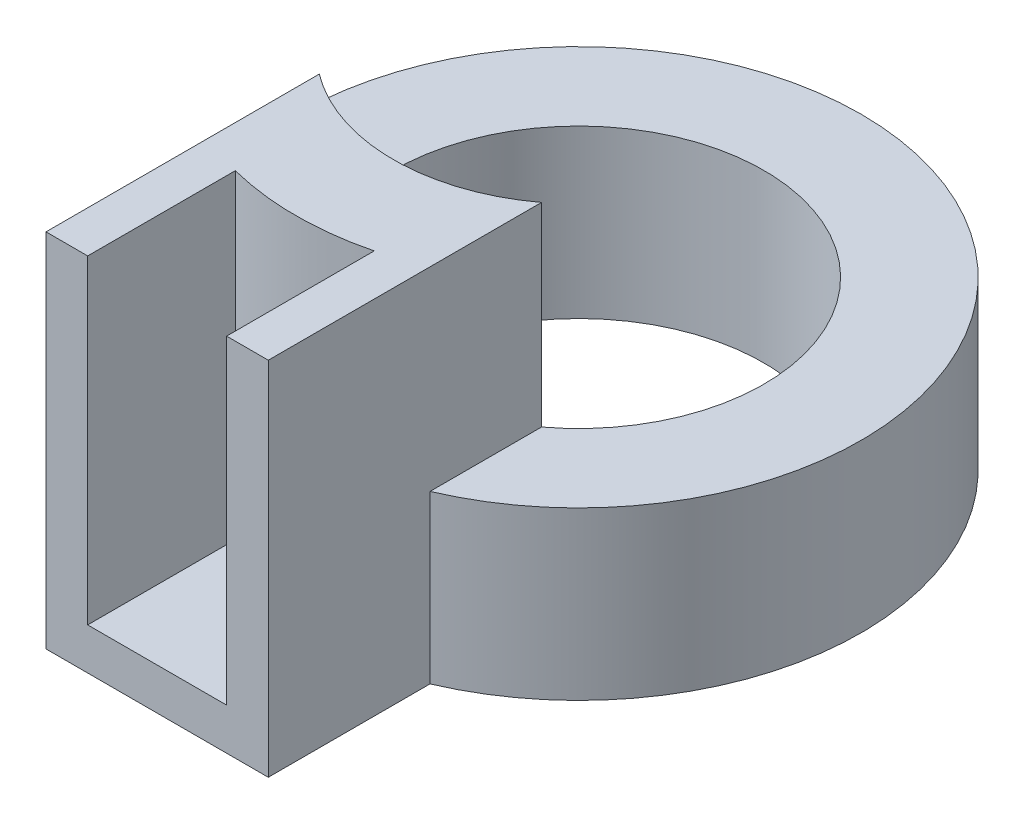
ISO-10303-21;
HEADER;
FILE_DESCRIPTION(('STEP AP214'),'2;1');
FILE_NAME('part.step','',(''),(''),'','','');
FILE_SCHEMA(('AUTOMOTIVE_DESIGN { 1 0 10303 214 1 1 1 1 }'));
ENDSEC;
DATA;
#1=APPLICATION_CONTEXT('core data for automotive mechanical design processes');
#2=APPLICATION_PROTOCOL_DEFINITION('international standard','automotive_design',2000,#1);
#3=PRODUCT_CONTEXT('',#1,'mechanical');
#4=PRODUCT('Part','Part','',(#3));
#5=PRODUCT_RELATED_PRODUCT_CATEGORY('part','',(#4));
#6=PRODUCT_DEFINITION_FORMATION('','',#4);
#7=PRODUCT_DEFINITION_CONTEXT('part definition',#1,'design');
#8=PRODUCT_DEFINITION('design','',#6,#7);
#9=PRODUCT_DEFINITION_SHAPE('','',#8);
#10=(LENGTH_UNIT() NAMED_UNIT(*) SI_UNIT(.MILLI.,.METRE.));
#11=(NAMED_UNIT(*) PLANE_ANGLE_UNIT() SI_UNIT($,.RADIAN.));
#12=(NAMED_UNIT(*) SI_UNIT($,.STERADIAN.) SOLID_ANGLE_UNIT());
#13=UNCERTAINTY_MEASURE_WITH_UNIT(LENGTH_MEASURE(1.E-05),#10,'distance_accuracy_value','');
#14=(GEOMETRIC_REPRESENTATION_CONTEXT(3) GLOBAL_UNCERTAINTY_ASSIGNED_CONTEXT((#13)) GLOBAL_UNIT_ASSIGNED_CONTEXT((#10,
#11,#12)) REPRESENTATION_CONTEXT('',''));
#15=CARTESIAN_POINT('',(0.,0.,0.));
#16=DIRECTION('',(0.,0.,1.));
#17=DIRECTION('',(1.,0.,0.));
#18=AXIS2_PLACEMENT_3D('',#15,#16,#17);
#19=CARTESIAN_POINT('',(-5.,23.,-20.336));
#20=DIRECTION('',(-1.,0.,0.));
#21=DIRECTION('',(0.,-1.,0.));
#22=AXIS2_PLACEMENT_3D('',#19,#20,#21);
#23=PLANE('',#22);
#24=DIRECTION('',(0.,-1.,0.));
#25=VECTOR('',#24,1.);
#26=CARTESIAN_POINT('',(-5.,12.,19.7107134574069));
#27=LINE('',#26,#25);
#28=CARTESIAN_POINT('',(-5.,3.,19.7107134574069));
#29=VERTEX_POINT('',#28);
#30=CARTESIAN_POINT('',(-4.99999999999999,26.,19.7107134574069));
#31=VERTEX_POINT('',#30);
#32=EDGE_CURVE('E123',#29,#31,#27,.F.);
#33=ORIENTED_EDGE('',*,*,#32,.T.);
#34=DIRECTION('',(0.,0.,1.));
#35=VECTOR('',#34,1.);
#36=CARTESIAN_POINT('',(-5.,26.,-20.336));
#37=LINE('',#36,#35);
#38=CARTESIAN_POINT('',(-5.,26.,30.335));
#39=VERTEX_POINT('',#38);
#40=EDGE_CURVE('E133',#31,#39,#37,.T.);
#41=ORIENTED_EDGE('',*,*,#40,.T.);
#42=DIRECTION('',(0.,-1.,0.));
#43=VECTOR('',#42,1.);
#44=CARTESIAN_POINT('',(-5.,23.,30.335));
#45=LINE('',#44,#43);
#46=CARTESIAN_POINT('',(-5.,3.,30.335));
#47=VERTEX_POINT('',#46);
#48=EDGE_CURVE('E54',#39,#47,#45,.T.);
#49=ORIENTED_EDGE('',*,*,#48,.T.);
#50=DIRECTION('',(0.,0.,1.));
#51=VECTOR('',#50,1.);
#52=CARTESIAN_POINT('',(-5.,3.,-20.336));
#53=LINE('',#52,#51);
#54=EDGE_CURVE('E176',#29,#47,#53,.T.);
#55=ORIENTED_EDGE('',*,*,#54,.F.);
#56=EDGE_LOOP('',(#33,#41,#49,#55));
#57=FACE_BOUND('',#56,.T.);
#58=ADVANCED_FACE('F39',(#57),#23,.F.);
#59=CARTESIAN_POINT('',(5.,23.,-20.336));
#60=DIRECTION('',(1.,0.,0.));
#61=DIRECTION('',(0.,1.,0.));
#62=AXIS2_PLACEMENT_3D('',#59,#60,#61);
#63=PLANE('',#62);
#64=DIRECTION('',(0.,0.,1.));
#65=VECTOR('',#64,1.);
#66=CARTESIAN_POINT('',(5.,26.,-20.336));
#67=LINE('',#66,#65);
#68=CARTESIAN_POINT('',(5.,26.,19.7107134574069));
#69=VERTEX_POINT('',#68);
#70=CARTESIAN_POINT('',(5.,26.,30.335));
#71=VERTEX_POINT('',#70);
#72=EDGE_CURVE('E126',#69,#71,#67,.T.);
#73=ORIENTED_EDGE('',*,*,#72,.F.);
#74=DIRECTION('',(0.,-1.,0.));
#75=VECTOR('',#74,1.);
#76=CARTESIAN_POINT('',(5.,12.,19.7107134574069));
#77=LINE('',#76,#75);
#78=CARTESIAN_POINT('',(5.,3.,19.7107134574069));
#79=VERTEX_POINT('',#78);
#80=EDGE_CURVE('E115',#69,#79,#77,.T.);
#81=ORIENTED_EDGE('',*,*,#80,.T.);
#82=DIRECTION('',(0.,0.,1.));
#83=VECTOR('',#82,1.);
#84=CARTESIAN_POINT('',(5.,3.,-20.336));
#85=LINE('',#84,#83);
#86=CARTESIAN_POINT('',(5.,3.,30.335));
#87=VERTEX_POINT('',#86);
#88=EDGE_CURVE('E169',#79,#87,#85,.T.);
#89=ORIENTED_EDGE('',*,*,#88,.T.);
#90=DIRECTION('',(0.,1.,0.));
#91=VECTOR('',#90,1.);
#92=CARTESIAN_POINT('',(5.,23.,30.335));
#93=LINE('',#92,#91);
#94=EDGE_CURVE('E129',#87,#71,#93,.T.);
#95=ORIENTED_EDGE('',*,*,#94,.T.);
#96=EDGE_LOOP('',(#73,#81,#89,#95));
#97=FACE_BOUND('',#96,.T.);
#98=ADVANCED_FACE('F127',(#97),#63,.F.);
#99=CARTESIAN_POINT('',(-8.,26.,-20.336));
#100=DIRECTION('',(0.,1.,0.));
#101=DIRECTION('',(0.,0.,1.));
#102=AXIS2_PLACEMENT_3D('',#99,#100,#101);
#103=PLANE('',#102);
#104=ORIENTED_EDGE('',*,*,#72,.T.);
#105=DIRECTION('',(-1.,0.,0.));
#106=VECTOR('',#105,1.);
#107=CARTESIAN_POINT('',(-8.,26.,30.335));
#108=LINE('',#107,#106);
#109=CARTESIAN_POINT('',(8.,26.,30.335));
#110=VERTEX_POINT('',#109);
#111=EDGE_CURVE('E146',#110,#71,#108,.T.);
#112=ORIENTED_EDGE('',*,*,#111,.F.);
#113=DIRECTION('',(0.,0.,1.));
#114=VECTOR('',#113,1.);
#115=CARTESIAN_POINT('',(8.,26.,-20.336));
#116=LINE('',#115,#114);
#117=CARTESIAN_POINT('',(8.,26.,10.6687499267721));
#118=VERTEX_POINT('',#117);
#119=EDGE_CURVE('E162',#118,#110,#116,.T.);
#120=ORIENTED_EDGE('',*,*,#119,.F.);
#121=CARTESIAN_POINT('',(0.,26.,0.));
#122=DIRECTION('',(0.,1.,0.));
#123=DIRECTION('',(0.,0.,1.));
#124=AXIS2_PLACEMENT_3D('',#121,#122,#123);
#125=CIRCLE('',#124,13.335);
#126=CARTESIAN_POINT('',(-7.99999999999999,26.,10.6687499267721));
#127=VERTEX_POINT('',#126);
#128=EDGE_CURVE('E157',#118,#127,#125,.F.);
#129=ORIENTED_EDGE('',*,*,#128,.T.);
#130=DIRECTION('',(0.,0.,1.));
#131=VECTOR('',#130,1.);
#132=CARTESIAN_POINT('',(-8.,26.,-20.336));
#133=LINE('',#132,#131);
#134=CARTESIAN_POINT('',(-8.,26.,30.335));
#135=VERTEX_POINT('',#134);
#136=EDGE_CURVE('E158',#127,#135,#133,.T.);
#137=ORIENTED_EDGE('',*,*,#136,.T.);
#138=EDGE_CURVE('E145',#39,#135,#108,.T.);
#139=ORIENTED_EDGE('',*,*,#138,.F.);
#140=ORIENTED_EDGE('',*,*,#40,.F.);
#141=CARTESIAN_POINT('',(0.,26.,0.));
#142=DIRECTION('',(0.,1.,0.));
#143=DIRECTION('',(0.,0.,1.));
#144=AXIS2_PLACEMENT_3D('',#141,#142,#143);
#145=CIRCLE('',#144,20.335);
#146=EDGE_CURVE('E119',#69,#31,#145,.F.);
#147=ORIENTED_EDGE('',*,*,#146,.F.);
#148=EDGE_LOOP('',(#104,#112,#120,#129,#137,#139,#140,#147));
#149=FACE_BOUND('',#148,.T.);
#150=ADVANCED_FACE('F135',(#149),#103,.T.);
#151=CARTESIAN_POINT('',(0.,12.,0.));
#152=DIRECTION('',(0.,-1.,0.));
#153=DIRECTION('',(0.,0.,-1.));
#154=AXIS2_PLACEMENT_3D('',#151,#152,#153);
#155=CYLINDRICAL_SURFACE('',#154,20.335);
#156=ORIENTED_EDGE('',*,*,#32,.F.);
#157=CARTESIAN_POINT('',(0.,3.,0.));
#158=DIRECTION('',(0.,-1.,0.));
#159=DIRECTION('',(0.,0.,-1.));
#160=AXIS2_PLACEMENT_3D('',#157,#158,#159);
#161=CIRCLE('',#160,20.335);
#162=EDGE_CURVE('E62',#79,#29,#161,.T.);
#163=ORIENTED_EDGE('',*,*,#162,.F.);
#164=ORIENTED_EDGE('',*,*,#80,.F.);
#165=ORIENTED_EDGE('',*,*,#146,.T.);
#166=EDGE_LOOP('',(#156,#163,#164,#165));
#167=FACE_BOUND('',#166,.T.);
#168=ADVANCED_FACE('F117',(#167),#155,.T.);
#169=CARTESIAN_POINT('',(0.,12.,0.));
#170=DIRECTION('',(0.,1.,0.));
#171=DIRECTION('',(0.,0.,1.));
#172=AXIS2_PLACEMENT_3D('',#169,#170,#171);
#173=PLANE('',#172);
#174=DIRECTION('',(0.,0.,-1.));
#175=VECTOR('',#174,1.);
#176=CARTESIAN_POINT('',(8.,12.,0.));
#177=LINE('',#176,#175);
#178=CARTESIAN_POINT('',(8.,12.,18.6952460534757));
#179=VERTEX_POINT('',#178);
#180=CARTESIAN_POINT('',(8.,12.,10.6687499267721));
#181=VERTEX_POINT('',#180);
#182=EDGE_CURVE('E187',#179,#181,#177,.T.);
#183=ORIENTED_EDGE('',*,*,#182,.F.);
#184=CARTESIAN_POINT('',(0.,12.,0.));
#185=DIRECTION('',(0.,1.,0.));
#186=DIRECTION('',(0.,0.,1.));
#187=AXIS2_PLACEMENT_3D('',#184,#185,#186);
#188=CIRCLE('',#187,20.335);
#189=CARTESIAN_POINT('',(-7.99999999999999,12.,18.6952460534757));
#190=VERTEX_POINT('',#189);
#191=EDGE_CURVE('E11',#179,#190,#188,.T.);
#192=ORIENTED_EDGE('',*,*,#191,.T.);
#193=DIRECTION('',(0.,0.,1.));
#194=VECTOR('',#193,1.);
#195=CARTESIAN_POINT('',(-8.,12.,0.));
#196=LINE('',#195,#194);
#197=CARTESIAN_POINT('',(-7.99999999999999,12.,10.6687499267721));
#198=VERTEX_POINT('',#197);
#199=EDGE_CURVE('E182',#198,#190,#196,.T.);
#200=ORIENTED_EDGE('',*,*,#199,.F.);
#201=CARTESIAN_POINT('',(0.,12.,0.));
#202=DIRECTION('',(0.,1.,0.));
#203=DIRECTION('',(0.,0.,1.));
#204=AXIS2_PLACEMENT_3D('',#201,#202,#203);
#205=CIRCLE('',#204,13.335);
#206=EDGE_CURVE('E191',#181,#198,#205,.T.);
#207=ORIENTED_EDGE('',*,*,#206,.F.);
#208=EDGE_LOOP('',(#183,#192,#200,#207));
#209=FACE_BOUND('',#208,.T.);
#210=ADVANCED_FACE('F225',(#209),#173,.T.);
#211=CARTESIAN_POINT('',(0.,0.,0.));
#212=DIRECTION('',(0.,1.,0.));
#213=DIRECTION('',(0.,0.,1.));
#214=AXIS2_PLACEMENT_3D('',#211,#212,#213);
#215=PLANE('',#214);
#216=CARTESIAN_POINT('',(0.,0.,0.));
#217=DIRECTION('',(0.,1.,0.));
#218=DIRECTION('',(0.,0.,1.));
#219=AXIS2_PLACEMENT_3D('',#216,#217,#218);
#220=CIRCLE('',#219,13.335);
#221=CARTESIAN_POINT('',(0.,0.,13.335));
#222=VERTEX_POINT('',#221);
#223=EDGE_CURVE('E190',#222,#222,#220,.T.);
#224=ORIENTED_EDGE('',*,*,#223,.T.);
#225=EDGE_LOOP('',(#224));
#226=FACE_BOUND('',#225,.T.);
#227=CARTESIAN_POINT('',(0.,0.,0.));
#228=DIRECTION('',(0.,1.,0.));
#229=DIRECTION('',(0.,0.,1.));
#230=AXIS2_PLACEMENT_3D('',#227,#228,#229);
#231=CIRCLE('',#230,20.335);
#232=CARTESIAN_POINT('',(8.,0.,18.6952460534757));
#233=VERTEX_POINT('',#232);
#234=CARTESIAN_POINT('',(-7.99999999999999,0.,18.6952460534757));
#235=VERTEX_POINT('',#234);
#236=EDGE_CURVE('E43',#233,#235,#231,.T.);
#237=ORIENTED_EDGE('',*,*,#236,.F.);
#238=DIRECTION('',(0.,0.,1.));
#239=VECTOR('',#238,1.);
#240=CARTESIAN_POINT('',(8.,0.,-20.336));
#241=LINE('',#240,#239);
#242=CARTESIAN_POINT('',(8.,0.,30.335));
#243=VERTEX_POINT('',#242);
#244=EDGE_CURVE('E164',#233,#243,#241,.T.);
#245=ORIENTED_EDGE('',*,*,#244,.T.);
#246=DIRECTION('',(1.,0.,0.));
#247=VECTOR('',#246,1.);
#248=CARTESIAN_POINT('',(-8.,0.,30.335));
#249=LINE('',#248,#247);
#250=CARTESIAN_POINT('',(-8.,0.,30.335));
#251=VERTEX_POINT('',#250);
#252=EDGE_CURVE('E151',#251,#243,#249,.T.);
#253=ORIENTED_EDGE('',*,*,#252,.F.);
#254=DIRECTION('',(0.,0.,1.));
#255=VECTOR('',#254,1.);
#256=CARTESIAN_POINT('',(-8.,0.,-20.336));
#257=LINE('',#256,#255);
#258=EDGE_CURVE('E167',#235,#251,#257,.T.);
#259=ORIENTED_EDGE('',*,*,#258,.F.);
#260=EDGE_LOOP('',(#237,#245,#253,#259));
#261=FACE_BOUND('',#260,.T.);
#262=ADVANCED_FACE('F197',(#226,#261),#215,.F.);
#263=ORIENTED_EDGE('',*,*,#191,.F.);
#264=DIRECTION('',(0.,-1.,0.));
#265=VECTOR('',#264,1.);
#266=CARTESIAN_POINT('',(8.,12.,18.6952460534757));
#267=LINE('',#266,#265);
#268=EDGE_CURVE('E185',#179,#233,#267,.T.);
#269=ORIENTED_EDGE('',*,*,#268,.T.);
#270=ORIENTED_EDGE('',*,*,#236,.T.);
#271=DIRECTION('',(0.,-1.,0.));
#272=VECTOR('',#271,1.);
#273=CARTESIAN_POINT('',(-7.99999999999999,12.,18.6952460534757));
#274=LINE('',#273,#272);
#275=EDGE_CURVE('E180',#235,#190,#274,.F.);
#276=ORIENTED_EDGE('',*,*,#275,.T.);
#277=EDGE_LOOP('',(#263,#269,#270,#276));
#278=FACE_BOUND('',#277,.T.);
#279=ADVANCED_FACE('F41',(#278),#155,.T.);
#280=CARTESIAN_POINT('',(0.,12.,0.));
#281=DIRECTION('',(0.,-1.,0.));
#282=DIRECTION('',(0.,0.,-1.));
#283=AXIS2_PLACEMENT_3D('',#280,#281,#282);
#284=CYLINDRICAL_SURFACE('',#283,13.335);
#285=ORIENTED_EDGE('',*,*,#223,.F.);
#286=EDGE_LOOP('',(#285));
#287=FACE_BOUND('',#286,.T.);
#288=ORIENTED_EDGE('',*,*,#206,.T.);
#289=DIRECTION('',(0.,-1.,0.));
#290=VECTOR('',#289,1.);
#291=CARTESIAN_POINT('',(-7.99999999999999,12.,10.6687499267721));
#292=LINE('',#291,#290);
#293=EDGE_CURVE('E166',#127,#198,#292,.T.);
#294=ORIENTED_EDGE('',*,*,#293,.F.);
#295=ORIENTED_EDGE('',*,*,#128,.F.);
#296=DIRECTION('',(0.,-1.,0.));
#297=VECTOR('',#296,1.);
#298=CARTESIAN_POINT('',(8.,12.,10.6687499267721));
#299=LINE('',#298,#297);
#300=EDGE_CURVE('E161',#181,#118,#299,.F.);
#301=ORIENTED_EDGE('',*,*,#300,.F.);
#302=EDGE_LOOP('',(#288,#294,#295,#301));
#303=FACE_BOUND('',#302,.T.);
#304=ADVANCED_FACE('F200',(#287,#303),#284,.F.);
#305=CARTESIAN_POINT('',(-5.,3.,-20.336));
#306=DIRECTION('',(0.,-1.,0.));
#307=DIRECTION('',(0.,0.,-1.));
#308=AXIS2_PLACEMENT_3D('',#305,#306,#307);
#309=PLANE('',#308);
#310=ORIENTED_EDGE('',*,*,#88,.F.);
#311=ORIENTED_EDGE('',*,*,#162,.T.);
#312=ORIENTED_EDGE('',*,*,#54,.T.);
#313=DIRECTION('',(1.,0.,0.));
#314=VECTOR('',#313,1.);
#315=CARTESIAN_POINT('',(-5.,3.,30.335));
#316=LINE('',#315,#314);
#317=EDGE_CURVE('E141',#47,#87,#316,.T.);
#318=ORIENTED_EDGE('',*,*,#317,.T.);
#319=EDGE_LOOP('',(#310,#311,#312,#318));
#320=FACE_BOUND('',#319,.T.);
#321=ADVANCED_FACE('F203',(#320),#309,.F.);
#322=CARTESIAN_POINT('',(8.,26.,-20.336));
#323=DIRECTION('',(1.,0.,0.));
#324=DIRECTION('',(0.,1.,0.));
#325=AXIS2_PLACEMENT_3D('',#322,#323,#324);
#326=PLANE('',#325);
#327=ORIENTED_EDGE('',*,*,#268,.F.);
#328=ORIENTED_EDGE('',*,*,#182,.T.);
#329=ORIENTED_EDGE('',*,*,#300,.T.);
#330=ORIENTED_EDGE('',*,*,#119,.T.);
#331=DIRECTION('',(0.,1.,0.));
#332=VECTOR('',#331,1.);
#333=CARTESIAN_POINT('',(8.,26.,30.335));
#334=LINE('',#333,#332);
#335=EDGE_CURVE('E154',#243,#110,#334,.T.);
#336=ORIENTED_EDGE('',*,*,#335,.F.);
#337=ORIENTED_EDGE('',*,*,#244,.F.);
#338=EDGE_LOOP('',(#327,#328,#329,#330,#336,#337));
#339=FACE_BOUND('',#338,.T.);
#340=ADVANCED_FACE('F217',(#339),#326,.T.);
#341=CARTESIAN_POINT('',(-8.,26.,-20.336));
#342=DIRECTION('',(-1.,0.,0.));
#343=DIRECTION('',(0.,-1.,0.));
#344=AXIS2_PLACEMENT_3D('',#341,#342,#343);
#345=PLANE('',#344);
#346=ORIENTED_EDGE('',*,*,#293,.T.);
#347=ORIENTED_EDGE('',*,*,#199,.T.);
#348=ORIENTED_EDGE('',*,*,#275,.F.);
#349=ORIENTED_EDGE('',*,*,#258,.T.);
#350=DIRECTION('',(0.,-1.,0.));
#351=VECTOR('',#350,1.);
#352=CARTESIAN_POINT('',(-8.,26.,30.335));
#353=LINE('',#352,#351);
#354=EDGE_CURVE('E148',#135,#251,#353,.T.);
#355=ORIENTED_EDGE('',*,*,#354,.F.);
#356=ORIENTED_EDGE('',*,*,#136,.F.);
#357=EDGE_LOOP('',(#346,#347,#348,#349,#355,#356));
#358=FACE_BOUND('',#357,.T.);
#359=ADVANCED_FACE('F210',(#358),#345,.T.);
#360=CARTESIAN_POINT('',(0.,0.,30.335));
#361=DIRECTION('',(0.,0.,-1.));
#362=DIRECTION('',(-1.,0.,0.));
#363=AXIS2_PLACEMENT_3D('',#360,#361,#362);
#364=PLANE('',#363);
#365=ORIENTED_EDGE('',*,*,#111,.T.);
#366=ORIENTED_EDGE('',*,*,#94,.F.);
#367=ORIENTED_EDGE('',*,*,#317,.F.);
#368=ORIENTED_EDGE('',*,*,#48,.F.);
#369=ORIENTED_EDGE('',*,*,#138,.T.);
#370=ORIENTED_EDGE('',*,*,#354,.T.);
#371=ORIENTED_EDGE('',*,*,#252,.T.);
#372=ORIENTED_EDGE('',*,*,#335,.T.);
#373=EDGE_LOOP('',(#365,#366,#367,#368,#369,#370,#371,#372));
#374=FACE_BOUND('',#373,.T.);
#375=ADVANCED_FACE('F219',(#374),#364,.F.);
#376=CLOSED_SHELL('',(#58,#98,#150,#168,#210,#262,#279,#304,#321,#340,#359,#375));
#377=MANIFOLD_SOLID_BREP('B2',#376);
#378=ADVANCED_BREP_SHAPE_REPRESENTATION('',(#18,#377),#14);
#379=SHAPE_DEFINITION_REPRESENTATION(#9,#378);
ENDSEC;
END-ISO-10303-21;
